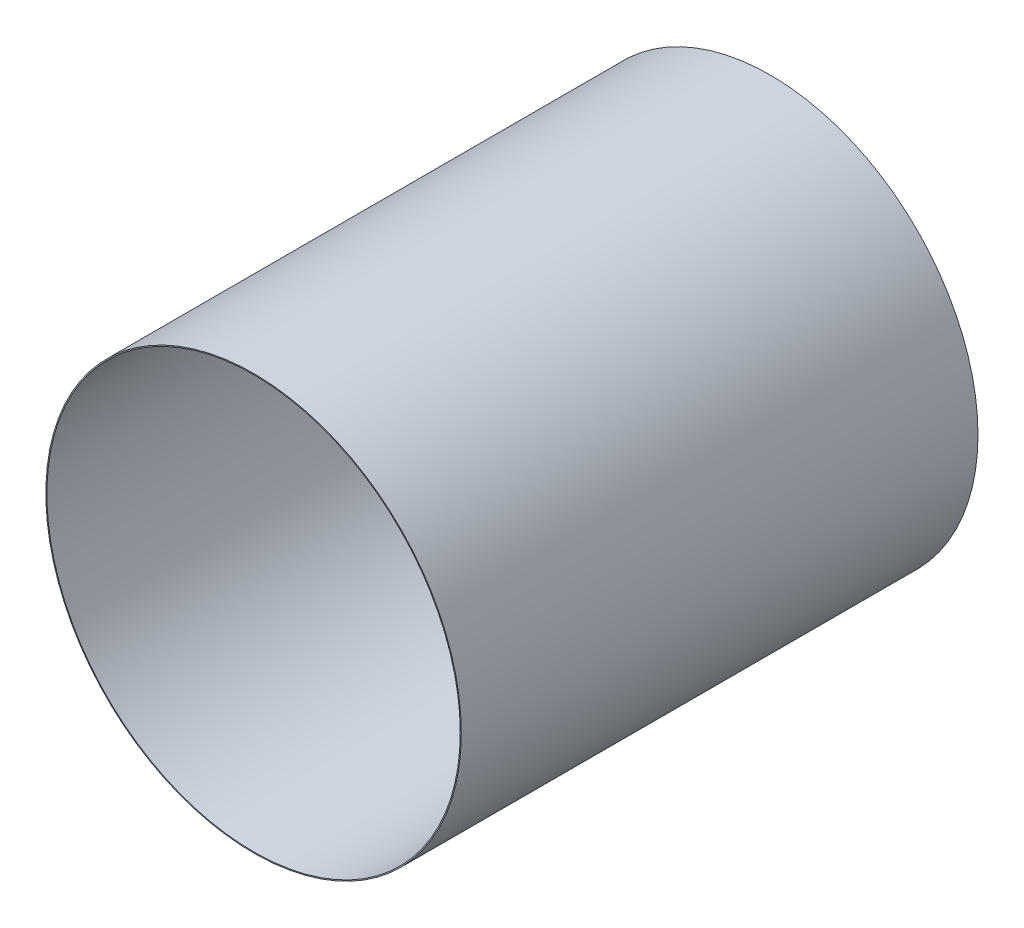
ISO-10303-21;
HEADER;
FILE_DESCRIPTION(('STEP AP214'),'2;1');
FILE_NAME('part.step','',(''),(''),'','','');
FILE_SCHEMA(('AUTOMOTIVE_DESIGN { 1 0 10303 214 1 1 1 1 }'));
ENDSEC;
DATA;
#1=APPLICATION_CONTEXT('core data for automotive mechanical design processes');
#2=APPLICATION_PROTOCOL_DEFINITION('international standard','automotive_design',2000,#1);
#3=PRODUCT_CONTEXT('',#1,'mechanical');
#4=PRODUCT('Part','Part','',(#3));
#5=PRODUCT_RELATED_PRODUCT_CATEGORY('part','',(#4));
#6=PRODUCT_DEFINITION_FORMATION('','',#4);
#7=PRODUCT_DEFINITION_CONTEXT('part definition',#1,'design');
#8=PRODUCT_DEFINITION('design','',#6,#7);
#9=PRODUCT_DEFINITION_SHAPE('','',#8);
#10=(LENGTH_UNIT() NAMED_UNIT(*) SI_UNIT(.MILLI.,.METRE.));
#11=(NAMED_UNIT(*) PLANE_ANGLE_UNIT() SI_UNIT($,.RADIAN.));
#12=(NAMED_UNIT(*) SI_UNIT($,.STERADIAN.) SOLID_ANGLE_UNIT());
#13=UNCERTAINTY_MEASURE_WITH_UNIT(LENGTH_MEASURE(1.E-05),#10,'distance_accuracy_value','');
#14=(GEOMETRIC_REPRESENTATION_CONTEXT(3) GLOBAL_UNCERTAINTY_ASSIGNED_CONTEXT((#13)) GLOBAL_UNIT_ASSIGNED_CONTEXT((#10,
#11,#12)) REPRESENTATION_CONTEXT('',''));
#15=CARTESIAN_POINT('',(0.,0.,0.));
#16=DIRECTION('',(0.,0.,1.));
#17=DIRECTION('',(1.,0.,0.));
#18=AXIS2_PLACEMENT_3D('',#15,#16,#17);
#19=CARTESIAN_POINT('',(0.,0.,25.));
#20=DIRECTION('',(0.,0.,1.));
#21=DIRECTION('',(1.,0.,0.));
#22=AXIS2_PLACEMENT_3D('',#19,#20,#21);
#23=PLANE('',#22);
#24=CARTESIAN_POINT('',(0.,0.,25.));
#25=DIRECTION('',(0.,0.,1.));
#26=DIRECTION('',(1.,0.,0.));
#27=AXIS2_PLACEMENT_3D('',#24,#25,#26);
#28=CIRCLE('',#27,10.05);
#29=CARTESIAN_POINT('',(10.05,0.,25.));
#30=VERTEX_POINT('',#29);
#31=EDGE_CURVE('E10',#30,#30,#28,.T.);
#32=ORIENTED_EDGE('',*,*,#31,.T.);
#33=EDGE_LOOP('',(#32));
#34=FACE_BOUND('',#33,.T.);
#35=CARTESIAN_POINT('',(0.,0.,25.));
#36=DIRECTION('',(0.,0.,1.));
#37=DIRECTION('',(1.,0.,0.));
#38=AXIS2_PLACEMENT_3D('',#35,#36,#37);
#39=CIRCLE('',#38,10.);
#40=CARTESIAN_POINT('',(10.,0.,25.));
#41=VERTEX_POINT('',#40);
#42=EDGE_CURVE('E42',#41,#41,#39,.T.);
#43=ORIENTED_EDGE('',*,*,#42,.F.);
#44=EDGE_LOOP('',(#43));
#45=FACE_BOUND('',#44,.T.);
#46=ADVANCED_FACE('F31',(#34,#45),#23,.T.);
#47=CARTESIAN_POINT('',(0.,0.,0.));
#48=DIRECTION('',(0.,0.,1.));
#49=DIRECTION('',(1.,0.,0.));
#50=AXIS2_PLACEMENT_3D('',#47,#48,#49);
#51=PLANE('',#50);
#52=CARTESIAN_POINT('',(0.,0.,0.));
#53=DIRECTION('',(0.,0.,1.));
#54=DIRECTION('',(1.,0.,0.));
#55=AXIS2_PLACEMENT_3D('',#52,#53,#54);
#56=CIRCLE('',#55,10.05);
#57=CARTESIAN_POINT('',(10.05,0.,0.));
#58=VERTEX_POINT('',#57);
#59=EDGE_CURVE('E35',#58,#58,#56,.T.);
#60=ORIENTED_EDGE('',*,*,#59,.F.);
#61=EDGE_LOOP('',(#60));
#62=FACE_BOUND('',#61,.T.);
#63=CARTESIAN_POINT('',(0.,0.,0.));
#64=DIRECTION('',(0.,0.,1.));
#65=DIRECTION('',(1.,0.,0.));
#66=AXIS2_PLACEMENT_3D('',#63,#64,#65);
#67=CIRCLE('',#66,10.);
#68=CARTESIAN_POINT('',(10.,0.,0.));
#69=VERTEX_POINT('',#68);
#70=EDGE_CURVE('E44',#69,#69,#67,.T.);
#71=ORIENTED_EDGE('',*,*,#70,.T.);
#72=EDGE_LOOP('',(#71));
#73=FACE_BOUND('',#72,.T.);
#74=ADVANCED_FACE('F54',(#62,#73),#51,.F.);
#75=CARTESIAN_POINT('',(0.,0.,25.));
#76=DIRECTION('',(0.,0.,-1.));
#77=DIRECTION('',(-1.,0.,0.));
#78=AXIS2_PLACEMENT_3D('',#75,#76,#77);
#79=CYLINDRICAL_SURFACE('',#78,10.05);
#80=ORIENTED_EDGE('',*,*,#31,.F.);
#81=EDGE_LOOP('',(#80));
#82=FACE_BOUND('',#81,.T.);
#83=ORIENTED_EDGE('',*,*,#59,.T.);
#84=EDGE_LOOP('',(#83));
#85=FACE_BOUND('',#84,.T.);
#86=ADVANCED_FACE('F33',(#82,#85),#79,.T.);
#87=CARTESIAN_POINT('',(0.,0.,25.));
#88=DIRECTION('',(0.,0.,-1.));
#89=DIRECTION('',(-1.,0.,0.));
#90=AXIS2_PLACEMENT_3D('',#87,#88,#89);
#91=CYLINDRICAL_SURFACE('',#90,10.);
#92=ORIENTED_EDGE('',*,*,#42,.T.);
#93=EDGE_LOOP('',(#92));
#94=FACE_BOUND('',#93,.T.);
#95=ORIENTED_EDGE('',*,*,#70,.F.);
#96=EDGE_LOOP('',(#95));
#97=FACE_BOUND('',#96,.T.);
#98=ADVANCED_FACE('F50',(#94,#97),#91,.F.);
#99=CLOSED_SHELL('',(#46,#74,#86,#98));
#100=MANIFOLD_SOLID_BREP('B2',#99);
#101=ADVANCED_BREP_SHAPE_REPRESENTATION('',(#18,#100),#14);
#102=SHAPE_DEFINITION_REPRESENTATION(#9,#101);
ENDSEC;
END-ISO-10303-21;
